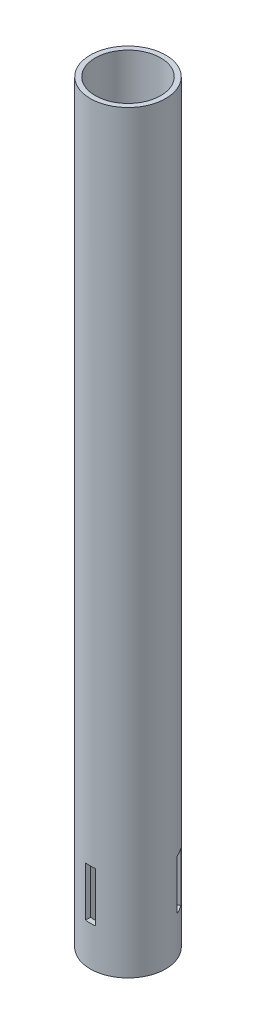
ISO-10303-21;
HEADER;
FILE_DESCRIPTION(('STEP AP214'),'2;1');
FILE_NAME('part.step','',(''),(''),'','','');
FILE_SCHEMA(('AUTOMOTIVE_DESIGN { 1 0 10303 214 1 1 1 1 }'));
ENDSEC;
DATA;
#1=APPLICATION_CONTEXT('core data for automotive mechanical design processes');
#2=APPLICATION_PROTOCOL_DEFINITION('international standard','automotive_design',2000,#1);
#3=PRODUCT_CONTEXT('',#1,'mechanical');
#4=PRODUCT('Part','Part','',(#3));
#5=PRODUCT_RELATED_PRODUCT_CATEGORY('part','',(#4));
#6=PRODUCT_DEFINITION_FORMATION('','',#4);
#7=PRODUCT_DEFINITION_CONTEXT('part definition',#1,'design');
#8=PRODUCT_DEFINITION('design','',#6,#7);
#9=PRODUCT_DEFINITION_SHAPE('','',#8);
#10=(LENGTH_UNIT() NAMED_UNIT(*) SI_UNIT(.MILLI.,.METRE.));
#11=(NAMED_UNIT(*) PLANE_ANGLE_UNIT() SI_UNIT($,.RADIAN.));
#12=(NAMED_UNIT(*) SI_UNIT($,.STERADIAN.) SOLID_ANGLE_UNIT());
#13=UNCERTAINTY_MEASURE_WITH_UNIT(LENGTH_MEASURE(1.E-05),#10,'distance_accuracy_value','');
#14=(GEOMETRIC_REPRESENTATION_CONTEXT(3) GLOBAL_UNCERTAINTY_ASSIGNED_CONTEXT((#13)) GLOBAL_UNIT_ASSIGNED_CONTEXT((#10,
#11,#12)) REPRESENTATION_CONTEXT('',''));
#15=CARTESIAN_POINT('',(0.,0.,0.));
#16=DIRECTION('',(0.,0.,1.));
#17=DIRECTION('',(1.,0.,0.));
#18=AXIS2_PLACEMENT_3D('',#15,#16,#17);
#19=CARTESIAN_POINT('',(0.,76.,0.));
#20=DIRECTION('',(0.,-1.,0.));
#21=DIRECTION('',(0.,0.,-1.));
#22=AXIS2_PLACEMENT_3D('',#19,#20,#21);
#23=CYLINDRICAL_SURFACE('',#22,3.8);
#24=CARTESIAN_POINT('',(0.,4.,0.));
#25=DIRECTION('',(0.,1.,0.));
#26=DIRECTION('',(0.,0.,1.));
#27=AXIS2_PLACEMENT_3D('',#24,#25,#26);
#28=CIRCLE('',#27,3.8);
#29=CARTESIAN_POINT('',(-0.5,4.,3.76696164036747));
#30=VERTEX_POINT('',#29);
#31=CARTESIAN_POINT('',(0.5,4.,3.76696164036747));
#32=VERTEX_POINT('',#31);
#33=EDGE_CURVE('E203',#30,#32,#28,.T.);
#34=ORIENTED_EDGE('',*,*,#33,.F.);
#35=DIRECTION('',(0.,-1.,0.));
#36=VECTOR('',#35,1.);
#37=CARTESIAN_POINT('',(-0.500000000000003,76.,3.76696164036747));
#38=LINE('',#37,#36);
#39=CARTESIAN_POINT('',(-0.500000000000003,8.99999999999999,3.76696164036747));
#40=VERTEX_POINT('',#39);
#41=EDGE_CURVE('E192',#30,#40,#38,.F.);
#42=ORIENTED_EDGE('',*,*,#41,.T.);
#43=CARTESIAN_POINT('',(0.,8.99999999999999,0.));
#44=DIRECTION('',(0.,1.,0.));
#45=DIRECTION('',(0.,0.,1.));
#46=AXIS2_PLACEMENT_3D('',#43,#44,#45);
#47=CIRCLE('',#46,3.8);
#48=CARTESIAN_POINT('',(0.5,8.99999999999999,3.76696164036747));
#49=VERTEX_POINT('',#48);
#50=EDGE_CURVE('E196',#40,#49,#47,.T.);
#51=ORIENTED_EDGE('',*,*,#50,.T.);
#52=DIRECTION('',(0.,-1.,0.));
#53=VECTOR('',#52,1.);
#54=CARTESIAN_POINT('',(0.499999999999997,76.,3.76696164036747));
#55=LINE('',#54,#53);
#56=EDGE_CURVE('E200',#32,#49,#55,.F.);
#57=ORIENTED_EDGE('',*,*,#56,.F.);
#58=EDGE_LOOP('',(#34,#42,#51,#57));
#59=FACE_BOUND('',#58,.T.);
#60=CARTESIAN_POINT('',(0.,76.,0.));
#61=DIRECTION('',(0.,1.,0.));
#62=DIRECTION('',(0.,0.,1.));
#63=AXIS2_PLACEMENT_3D('',#60,#61,#62);
#64=CIRCLE('',#63,3.8);
#65=CARTESIAN_POINT('',(0.,76.,3.8));
#66=VERTEX_POINT('',#65);
#67=EDGE_CURVE('E215',#66,#66,#64,.T.);
#68=ORIENTED_EDGE('',*,*,#67,.F.);
#69=EDGE_LOOP('',(#68));
#70=FACE_BOUND('',#69,.T.);
#71=CARTESIAN_POINT('',(0.,0.,0.));
#72=DIRECTION('',(0.,1.,0.));
#73=DIRECTION('',(0.,0.,1.));
#74=AXIS2_PLACEMENT_3D('',#71,#72,#73);
#75=CIRCLE('',#74,3.8);
#76=CARTESIAN_POINT('',(0.,0.,3.8));
#77=VERTEX_POINT('',#76);
#78=EDGE_CURVE('E211',#77,#77,#75,.T.);
#79=ORIENTED_EDGE('',*,*,#78,.T.);
#80=EDGE_LOOP('',(#79));
#81=FACE_BOUND('',#80,.T.);
#82=CARTESIAN_POINT('',(0.,4.,0.));
#83=DIRECTION('',(0.,1.,0.));
#84=DIRECTION('',(0.,0.,1.));
#85=AXIS2_PLACEMENT_3D('',#82,#83,#84);
#86=CIRCLE('',#85,3.8);
#87=CARTESIAN_POINT('',(-3.01228447563975,4.,-2.31649352207593));
#88=VERTEX_POINT('',#87);
#89=CARTESIAN_POINT('',(-3.51228447563974,4.,-1.45046811829149));
#90=VERTEX_POINT('',#89);
#91=EDGE_CURVE('E173',#88,#90,#86,.T.);
#92=ORIENTED_EDGE('',*,*,#91,.F.);
#93=DIRECTION('',(0.,-1.,0.));
#94=VECTOR('',#93,1.);
#95=CARTESIAN_POINT('',(-3.01228447563975,76.,-2.31649352207593));
#96=LINE('',#95,#94);
#97=CARTESIAN_POINT('',(-3.01228447563975,9.,-2.31649352207593));
#98=VERTEX_POINT('',#97);
#99=EDGE_CURVE('E143',#88,#98,#96,.F.);
#100=ORIENTED_EDGE('',*,*,#99,.T.);
#101=CARTESIAN_POINT('',(0.,8.99999999999999,0.));
#102=DIRECTION('',(0.,1.,0.));
#103=DIRECTION('',(0.,0.,1.));
#104=AXIS2_PLACEMENT_3D('',#101,#102,#103);
#105=CIRCLE('',#104,3.8);
#106=CARTESIAN_POINT('',(-3.51228447563975,9.,-1.45046811829148));
#107=VERTEX_POINT('',#106);
#108=EDGE_CURVE('E149',#98,#107,#105,.T.);
#109=ORIENTED_EDGE('',*,*,#108,.T.);
#110=DIRECTION('',(0.,-1.,0.));
#111=VECTOR('',#110,1.);
#112=CARTESIAN_POINT('',(-3.51228447563974,76.,-1.45046811829149));
#113=LINE('',#112,#111);
#114=EDGE_CURVE('E134',#90,#107,#113,.F.);
#115=ORIENTED_EDGE('',*,*,#114,.F.);
#116=EDGE_LOOP('',(#92,#100,#109,#115));
#117=FACE_BOUND('',#116,.T.);
#118=CARTESIAN_POINT('',(3.51228447563973,4.,-1.45046811829153));
#119=VERTEX_POINT('',#118);
#120=CARTESIAN_POINT('',(3.01228447563972,4.,-2.31649352207597));
#121=VERTEX_POINT('',#120);
#122=EDGE_CURVE('E176',#119,#121,#86,.T.);
#123=ORIENTED_EDGE('',*,*,#122,.F.);
#124=DIRECTION('',(0.,-1.,0.));
#125=VECTOR('',#124,1.);
#126=CARTESIAN_POINT('',(3.51228447563973,76.,-1.45046811829153));
#127=LINE('',#126,#125);
#128=CARTESIAN_POINT('',(3.51228447563973,8.99999999999999,-1.45046811829153));
#129=VERTEX_POINT('',#128);
#130=EDGE_CURVE('E161',#119,#129,#127,.F.);
#131=ORIENTED_EDGE('',*,*,#130,.T.);
#132=CARTESIAN_POINT('',(3.01228447563972,8.99999999999999,-2.31649352207597));
#133=VERTEX_POINT('',#132);
#134=EDGE_CURVE('E160',#129,#133,#105,.T.);
#135=ORIENTED_EDGE('',*,*,#134,.T.);
#136=DIRECTION('',(0.,-1.,0.));
#137=VECTOR('',#136,1.);
#138=CARTESIAN_POINT('',(3.01228447563972,76.,-2.31649352207597));
#139=LINE('',#138,#137);
#140=EDGE_CURVE('E166',#121,#133,#139,.F.);
#141=ORIENTED_EDGE('',*,*,#140,.F.);
#142=EDGE_LOOP('',(#123,#131,#135,#141));
#143=FACE_BOUND('',#142,.T.);
#144=ADVANCED_FACE('F45',(#59,#70,#81,#117,#143),#23,.T.);
#145=CARTESIAN_POINT('',(0.,76.,0.));
#146=DIRECTION('',(0.,-1.,0.));
#147=DIRECTION('',(0.,0.,-1.));
#148=AXIS2_PLACEMENT_3D('',#145,#146,#147);
#149=CYLINDRICAL_SURFACE('',#148,3.3);
#150=DIRECTION('',(0.,-1.,0.));
#151=VECTOR('',#150,1.);
#152=CARTESIAN_POINT('',(-2.57488937836512,76.,-2.06396334492221));
#153=LINE('',#152,#151);
#154=CARTESIAN_POINT('',(-2.57488937836513,4.,-2.0639633449222));
#155=VERTEX_POINT('',#154);
#156=CARTESIAN_POINT('',(-2.57488937836513,9.,-2.0639633449222));
#157=VERTEX_POINT('',#156);
#158=EDGE_CURVE('E244',#155,#157,#153,.F.);
#159=ORIENTED_EDGE('',*,*,#158,.F.);
#160=CARTESIAN_POINT('',(0.,4.,0.));
#161=DIRECTION('',(0.,1.,0.));
#162=DIRECTION('',(0.,0.,1.));
#163=AXIS2_PLACEMENT_3D('',#160,#161,#162);
#164=CIRCLE('',#163,3.3);
#165=CARTESIAN_POINT('',(-3.07488937836512,4.,-1.19793794113776));
#166=VERTEX_POINT('',#165);
#167=EDGE_CURVE('E55',#155,#166,#164,.T.);
#168=ORIENTED_EDGE('',*,*,#167,.T.);
#169=DIRECTION('',(0.,-1.,0.));
#170=VECTOR('',#169,1.);
#171=CARTESIAN_POINT('',(-3.07488937836512,76.,-1.19793794113776));
#172=LINE('',#171,#170);
#173=CARTESIAN_POINT('',(-3.07488937836512,8.99999999999999,-1.19793794113776));
#174=VERTEX_POINT('',#173);
#175=EDGE_CURVE('E236',#166,#174,#172,.F.);
#176=ORIENTED_EDGE('',*,*,#175,.T.);
#177=CARTESIAN_POINT('',(0.,8.99999999999999,0.));
#178=DIRECTION('',(0.,1.,0.));
#179=DIRECTION('',(0.,0.,1.));
#180=AXIS2_PLACEMENT_3D('',#177,#178,#179);
#181=CIRCLE('',#180,3.3);
#182=EDGE_CURVE('E152',#157,#174,#181,.T.);
#183=ORIENTED_EDGE('',*,*,#182,.F.);
#184=EDGE_LOOP('',(#159,#168,#176,#183));
#185=FACE_BOUND('',#184,.T.);
#186=CARTESIAN_POINT('',(0.,76.,0.));
#187=DIRECTION('',(0.,1.,0.));
#188=DIRECTION('',(0.,0.,1.));
#189=AXIS2_PLACEMENT_3D('',#186,#187,#188);
#190=CIRCLE('',#189,3.3);
#191=CARTESIAN_POINT('',(0.,76.,3.3));
#192=VERTEX_POINT('',#191);
#193=EDGE_CURVE('E207',#192,#192,#190,.T.);
#194=ORIENTED_EDGE('',*,*,#193,.T.);
#195=EDGE_LOOP('',(#194));
#196=FACE_BOUND('',#195,.T.);
#197=CARTESIAN_POINT('',(0.,0.,0.));
#198=DIRECTION('',(0.,1.,0.));
#199=DIRECTION('',(0.,0.,1.));
#200=AXIS2_PLACEMENT_3D('',#197,#198,#199);
#201=CIRCLE('',#200,3.3);
#202=CARTESIAN_POINT('',(0.,0.,3.3));
#203=VERTEX_POINT('',#202);
#204=EDGE_CURVE('E206',#203,#203,#201,.T.);
#205=ORIENTED_EDGE('',*,*,#204,.F.);
#206=EDGE_LOOP('',(#205));
#207=FACE_BOUND('',#206,.T.);
#208=DIRECTION('',(0.,-1.,0.));
#209=VECTOR('',#208,1.);
#210=CARTESIAN_POINT('',(-0.500000000000003,76.,3.26190128606002));
#211=LINE('',#210,#209);
#212=CARTESIAN_POINT('',(-0.500000000000003,4.,3.26190128606002));
#213=VERTEX_POINT('',#212);
#214=CARTESIAN_POINT('',(-0.5,9.,3.26190128606002));
#215=VERTEX_POINT('',#214);
#216=EDGE_CURVE('E219',#213,#215,#211,.F.);
#217=ORIENTED_EDGE('',*,*,#216,.F.);
#218=CARTESIAN_POINT('',(0.,4.,0.));
#219=DIRECTION('',(0.,1.,0.));
#220=DIRECTION('',(0.,0.,1.));
#221=AXIS2_PLACEMENT_3D('',#218,#219,#220);
#222=CIRCLE('',#221,3.3);
#223=CARTESIAN_POINT('',(0.5,4.,3.26190128606002));
#224=VERTEX_POINT('',#223);
#225=EDGE_CURVE('E232',#213,#224,#222,.T.);
#226=ORIENTED_EDGE('',*,*,#225,.T.);
#227=DIRECTION('',(0.,-1.,0.));
#228=VECTOR('',#227,1.);
#229=CARTESIAN_POINT('',(0.499999999999997,76.,3.26190128606002));
#230=LINE('',#229,#228);
#231=CARTESIAN_POINT('',(0.5,8.99999999999999,3.26190128606002));
#232=VERTEX_POINT('',#231);
#233=EDGE_CURVE('E228',#224,#232,#230,.F.);
#234=ORIENTED_EDGE('',*,*,#233,.T.);
#235=CARTESIAN_POINT('',(0.,8.99999999999999,0.));
#236=DIRECTION('',(0.,1.,0.));
#237=DIRECTION('',(0.,0.,1.));
#238=AXIS2_PLACEMENT_3D('',#235,#236,#237);
#239=CIRCLE('',#238,3.3);
#240=EDGE_CURVE('E225',#215,#232,#239,.T.);
#241=ORIENTED_EDGE('',*,*,#240,.F.);
#242=EDGE_LOOP('',(#217,#226,#234,#241));
#243=FACE_BOUND('',#242,.T.);
#244=DIRECTION('',(0.,-1.,0.));
#245=VECTOR('',#244,1.);
#246=CARTESIAN_POINT('',(3.0748893783651,76.,-1.1979379411378));
#247=LINE('',#246,#245);
#248=CARTESIAN_POINT('',(3.0748893783651,4.,-1.1979379411378));
#249=VERTEX_POINT('',#248);
#250=CARTESIAN_POINT('',(3.0748893783651,9.,-1.1979379411378));
#251=VERTEX_POINT('',#250);
#252=EDGE_CURVE('E246',#249,#251,#247,.F.);
#253=ORIENTED_EDGE('',*,*,#252,.F.);
#254=CARTESIAN_POINT('',(2.5748893783651,4.,-2.06396334492224));
#255=VERTEX_POINT('',#254);
#256=EDGE_CURVE('E11',#249,#255,#164,.T.);
#257=ORIENTED_EDGE('',*,*,#256,.T.);
#258=DIRECTION('',(0.,-1.,0.));
#259=VECTOR('',#258,1.);
#260=CARTESIAN_POINT('',(2.5748893783651,76.,-2.06396334492224));
#261=LINE('',#260,#259);
#262=CARTESIAN_POINT('',(2.5748893783651,8.99999999999999,-2.06396334492224));
#263=VERTEX_POINT('',#262);
#264=EDGE_CURVE('E48',#255,#263,#261,.F.);
#265=ORIENTED_EDGE('',*,*,#264,.T.);
#266=EDGE_CURVE('E240',#251,#263,#181,.T.);
#267=ORIENTED_EDGE('',*,*,#266,.F.);
#268=EDGE_LOOP('',(#253,#257,#265,#267));
#269=FACE_BOUND('',#268,.T.);
#270=ADVANCED_FACE('F257',(#185,#196,#207,#243,#269),#149,.F.);
#271=CARTESIAN_POINT('',(0.,76.,0.));
#272=DIRECTION('',(0.,1.,0.));
#273=DIRECTION('',(0.,0.,1.));
#274=AXIS2_PLACEMENT_3D('',#271,#272,#273);
#275=PLANE('',#274);
#276=ORIENTED_EDGE('',*,*,#67,.T.);
#277=EDGE_LOOP('',(#276));
#278=FACE_BOUND('',#277,.T.);
#279=ORIENTED_EDGE('',*,*,#193,.F.);
#280=EDGE_LOOP('',(#279));
#281=FACE_BOUND('',#280,.T.);
#282=ADVANCED_FACE('F311',(#278,#281),#275,.T.);
#283=CARTESIAN_POINT('',(0.,0.,0.));
#284=DIRECTION('',(0.,1.,0.));
#285=DIRECTION('',(0.,0.,1.));
#286=AXIS2_PLACEMENT_3D('',#283,#284,#285);
#287=PLANE('',#286);
#288=ORIENTED_EDGE('',*,*,#78,.F.);
#289=EDGE_LOOP('',(#288));
#290=FACE_BOUND('',#289,.T.);
#291=ORIENTED_EDGE('',*,*,#204,.T.);
#292=EDGE_LOOP('',(#291));
#293=FACE_BOUND('',#292,.T.);
#294=ADVANCED_FACE('F320',(#290,#293),#287,.F.);
#295=CARTESIAN_POINT('',(-0.5,4.,7.99999999999999));
#296=DIRECTION('',(0.,1.,0.));
#297=DIRECTION('',(0.,0.,1.));
#298=AXIS2_PLACEMENT_3D('',#295,#296,#297);
#299=PLANE('',#298);
#300=ORIENTED_EDGE('',*,*,#33,.T.);
#301=DIRECTION('',(0.,0.,-1.));
#302=VECTOR('',#301,1.);
#303=CARTESIAN_POINT('',(0.5,4.,7.99999999999999));
#304=LINE('',#303,#302);
#305=EDGE_CURVE('E188',#32,#224,#304,.T.);
#306=ORIENTED_EDGE('',*,*,#305,.T.);
#307=ORIENTED_EDGE('',*,*,#225,.F.);
#308=DIRECTION('',(0.,0.,-1.));
#309=VECTOR('',#308,1.);
#310=CARTESIAN_POINT('',(-0.5,4.,7.99999999999999));
#311=LINE('',#310,#309);
#312=EDGE_CURVE('E177',#30,#213,#311,.T.);
#313=ORIENTED_EDGE('',*,*,#312,.F.);
#314=EDGE_LOOP('',(#300,#306,#307,#313));
#315=FACE_BOUND('',#314,.T.);
#316=ADVANCED_FACE('F323',(#315),#299,.T.);
#317=CARTESIAN_POINT('',(0.5,4.,7.99999999999999));
#318=DIRECTION('',(-1.,0.,0.));
#319=DIRECTION('',(0.,-1.,0.));
#320=AXIS2_PLACEMENT_3D('',#317,#318,#319);
#321=PLANE('',#320);
#322=ORIENTED_EDGE('',*,*,#56,.T.);
#323=DIRECTION('',(0.,0.,-1.));
#324=VECTOR('',#323,1.);
#325=CARTESIAN_POINT('',(0.5,9.,7.99999999999999));
#326=LINE('',#325,#324);
#327=EDGE_CURVE('E184',#49,#232,#326,.T.);
#328=ORIENTED_EDGE('',*,*,#327,.T.);
#329=ORIENTED_EDGE('',*,*,#233,.F.);
#330=ORIENTED_EDGE('',*,*,#305,.F.);
#331=EDGE_LOOP('',(#322,#328,#329,#330));
#332=FACE_BOUND('',#331,.T.);
#333=ADVANCED_FACE('F340',(#332),#321,.T.);
#334=CARTESIAN_POINT('',(-0.5,9.,7.99999999999999));
#335=DIRECTION('',(0.,1.,0.));
#336=DIRECTION('',(0.,0.,1.));
#337=AXIS2_PLACEMENT_3D('',#334,#335,#336);
#338=PLANE('',#337);
#339=DIRECTION('',(0.,0.,-1.));
#340=VECTOR('',#339,1.);
#341=CARTESIAN_POINT('',(-0.5,9.,7.99999999999999));
#342=LINE('',#341,#340);
#343=EDGE_CURVE('E180',#40,#215,#342,.T.);
#344=ORIENTED_EDGE('',*,*,#343,.T.);
#345=ORIENTED_EDGE('',*,*,#240,.T.);
#346=ORIENTED_EDGE('',*,*,#327,.F.);
#347=ORIENTED_EDGE('',*,*,#50,.F.);
#348=EDGE_LOOP('',(#344,#345,#346,#347));
#349=FACE_BOUND('',#348,.T.);
#350=ADVANCED_FACE('F335',(#349),#338,.F.);
#351=CARTESIAN_POINT('',(-0.5,4.,7.99999999999999));
#352=DIRECTION('',(-1.,0.,0.));
#353=DIRECTION('',(0.,-1.,0.));
#354=AXIS2_PLACEMENT_3D('',#351,#352,#353);
#355=PLANE('',#354);
#356=ORIENTED_EDGE('',*,*,#312,.T.);
#357=ORIENTED_EDGE('',*,*,#216,.T.);
#358=ORIENTED_EDGE('',*,*,#343,.F.);
#359=ORIENTED_EDGE('',*,*,#41,.F.);
#360=EDGE_LOOP('',(#356,#357,#358,#359));
#361=FACE_BOUND('',#360,.T.);
#362=ADVANCED_FACE('F331',(#361),#355,.F.);
#363=CARTESIAN_POINT('',(-7.17820323027553,4.,-3.56698729810771));
#364=DIRECTION('',(0.499999999999992,0.,-0.866025403784443));
#365=DIRECTION('',(-0.866025403784443,0.,-0.499999999999992));
#366=AXIS2_PLACEMENT_3D('',#363,#364,#365);
#367=PLANE('',#366);
#368=ORIENTED_EDGE('',*,*,#114,.T.);
#369=DIRECTION('',(0.866025403784443,0.,0.499999999999992));
#370=VECTOR('',#369,1.);
#371=CARTESIAN_POINT('',(-7.17820323027553,9.,-3.56698729810771));
#372=LINE('',#371,#370);
#373=EDGE_CURVE('E137',#107,#174,#372,.T.);
#374=ORIENTED_EDGE('',*,*,#373,.T.);
#375=ORIENTED_EDGE('',*,*,#175,.F.);
#376=DIRECTION('',(0.866025403784443,0.,0.499999999999992));
#377=VECTOR('',#376,1.);
#378=CARTESIAN_POINT('',(-7.17820323027553,4.,-3.56698729810771));
#379=LINE('',#378,#377);
#380=EDGE_CURVE('E70',#90,#166,#379,.T.);
#381=ORIENTED_EDGE('',*,*,#380,.F.);
#382=EDGE_LOOP('',(#368,#374,#375,#381));
#383=FACE_BOUND('',#382,.T.);
#384=ADVANCED_FACE('F136',(#383),#367,.T.);
#385=CARTESIAN_POINT('',(-6.67820323027554,4.,-4.43301270189215));
#386=DIRECTION('',(0.499999999999992,0.,-0.866025403784443));
#387=DIRECTION('',(-0.866025403784443,0.,-0.499999999999992));
#388=AXIS2_PLACEMENT_3D('',#385,#386,#387);
#389=PLANE('',#388);
#390=DIRECTION('',(0.866025403784443,0.,0.499999999999992));
#391=VECTOR('',#390,1.);
#392=CARTESIAN_POINT('',(-6.67820323027554,4.,-4.43301270189215));
#393=LINE('',#392,#391);
#394=EDGE_CURVE('E284',#88,#155,#393,.T.);
#395=ORIENTED_EDGE('',*,*,#394,.T.);
#396=ORIENTED_EDGE('',*,*,#158,.T.);
#397=DIRECTION('',(0.866025403784443,0.,0.499999999999992));
#398=VECTOR('',#397,1.);
#399=CARTESIAN_POINT('',(-6.67820323027554,9.,-4.43301270189215));
#400=LINE('',#399,#398);
#401=EDGE_CURVE('E155',#98,#157,#400,.T.);
#402=ORIENTED_EDGE('',*,*,#401,.F.);
#403=ORIENTED_EDGE('',*,*,#99,.F.);
#404=EDGE_LOOP('',(#395,#396,#402,#403));
#405=FACE_BOUND('',#404,.T.);
#406=ADVANCED_FACE('F290',(#405),#389,.F.);
#407=CARTESIAN_POINT('',(7.17820323027548,9.,-3.56698729810781));
#408=DIRECTION('',(0.,1.,0.));
#409=DIRECTION('',(0.,0.,1.));
#410=AXIS2_PLACEMENT_3D('',#407,#408,#409);
#411=PLANE('',#410);
#412=ORIENTED_EDGE('',*,*,#401,.T.);
#413=ORIENTED_EDGE('',*,*,#182,.T.);
#414=ORIENTED_EDGE('',*,*,#373,.F.);
#415=ORIENTED_EDGE('',*,*,#108,.F.);
#416=EDGE_LOOP('',(#412,#413,#414,#415));
#417=FACE_BOUND('',#416,.T.);
#418=ADVANCED_FACE('F148',(#417),#411,.F.);
#419=CARTESIAN_POINT('',(7.17820323027548,4.,-3.56698729810781));
#420=DIRECTION('',(0.,1.,0.));
#421=DIRECTION('',(0.,0.,1.));
#422=AXIS2_PLACEMENT_3D('',#419,#420,#421);
#423=PLANE('',#422);
#424=ORIENTED_EDGE('',*,*,#91,.T.);
#425=ORIENTED_EDGE('',*,*,#380,.T.);
#426=ORIENTED_EDGE('',*,*,#167,.F.);
#427=ORIENTED_EDGE('',*,*,#394,.F.);
#428=EDGE_LOOP('',(#424,#425,#426,#427));
#429=FACE_BOUND('',#428,.T.);
#430=ADVANCED_FACE('F294',(#429),#423,.T.);
#431=ORIENTED_EDGE('',*,*,#122,.T.);
#432=DIRECTION('',(-0.866025403784436,0.,0.500000000000004));
#433=VECTOR('',#432,1.);
#434=CARTESIAN_POINT('',(6.67820323027548,4.,-4.43301270189224));
#435=LINE('',#434,#433);
#436=EDGE_CURVE('E144',#121,#255,#435,.T.);
#437=ORIENTED_EDGE('',*,*,#436,.T.);
#438=ORIENTED_EDGE('',*,*,#256,.F.);
#439=DIRECTION('',(-0.866025403784436,0.,0.500000000000004));
#440=VECTOR('',#439,1.);
#441=CARTESIAN_POINT('',(7.17820323027548,4.,-3.56698729810781));
#442=LINE('',#441,#440);
#443=EDGE_CURVE('E277',#119,#249,#442,.T.);
#444=ORIENTED_EDGE('',*,*,#443,.F.);
#445=EDGE_LOOP('',(#431,#437,#438,#444));
#446=FACE_BOUND('',#445,.T.);
#447=ADVANCED_FACE('F266',(#446),#423,.T.);
#448=CARTESIAN_POINT('',(6.67820323027548,4.,-4.43301270189224));
#449=DIRECTION('',(0.500000000000004,0.,0.866025403784436));
#450=DIRECTION('',(0.866025403784436,0.,-0.500000000000004));
#451=AXIS2_PLACEMENT_3D('',#448,#449,#450);
#452=PLANE('',#451);
#453=ORIENTED_EDGE('',*,*,#140,.T.);
#454=DIRECTION('',(-0.866025403784436,0.,0.500000000000004));
#455=VECTOR('',#454,1.);
#456=CARTESIAN_POINT('',(6.67820323027548,9.,-4.43301270189224));
#457=LINE('',#456,#455);
#458=EDGE_CURVE('E264',#133,#263,#457,.T.);
#459=ORIENTED_EDGE('',*,*,#458,.T.);
#460=ORIENTED_EDGE('',*,*,#264,.F.);
#461=ORIENTED_EDGE('',*,*,#436,.F.);
#462=EDGE_LOOP('',(#453,#459,#460,#461));
#463=FACE_BOUND('',#462,.T.);
#464=ADVANCED_FACE('F262',(#463),#452,.T.);
#465=DIRECTION('',(-0.866025403784436,0.,0.500000000000004));
#466=VECTOR('',#465,1.);
#467=CARTESIAN_POINT('',(7.17820323027548,9.,-3.56698729810781));
#468=LINE('',#467,#466);
#469=EDGE_CURVE('E62',#129,#251,#468,.T.);
#470=ORIENTED_EDGE('',*,*,#469,.T.);
#471=ORIENTED_EDGE('',*,*,#266,.T.);
#472=ORIENTED_EDGE('',*,*,#458,.F.);
#473=ORIENTED_EDGE('',*,*,#134,.F.);
#474=EDGE_LOOP('',(#470,#471,#472,#473));
#475=FACE_BOUND('',#474,.T.);
#476=ADVANCED_FACE('F302',(#475),#411,.F.);
#477=CARTESIAN_POINT('',(7.17820323027548,4.,-3.56698729810781));
#478=DIRECTION('',(0.500000000000004,0.,0.866025403784436));
#479=DIRECTION('',(0.866025403784436,0.,-0.500000000000004));
#480=AXIS2_PLACEMENT_3D('',#477,#478,#479);
#481=PLANE('',#480);
#482=ORIENTED_EDGE('',*,*,#443,.T.);
#483=ORIENTED_EDGE('',*,*,#252,.T.);
#484=ORIENTED_EDGE('',*,*,#469,.F.);
#485=ORIENTED_EDGE('',*,*,#130,.F.);
#486=EDGE_LOOP('',(#482,#483,#484,#485));
#487=FACE_BOUND('',#486,.T.);
#488=ADVANCED_FACE('F450',(#487),#481,.F.);
#489=CLOSED_SHELL('',(#144,#270,#282,#294,#316,#333,#350,#362,#384,#406,#418,#430,#447,#464,
#476,#488));
#490=MANIFOLD_SOLID_BREP('B2',#489);
#491=ADVANCED_BREP_SHAPE_REPRESENTATION('',(#18,#490),#14);
#492=SHAPE_DEFINITION_REPRESENTATION(#9,#491);
ENDSEC;
END-ISO-10303-21;
